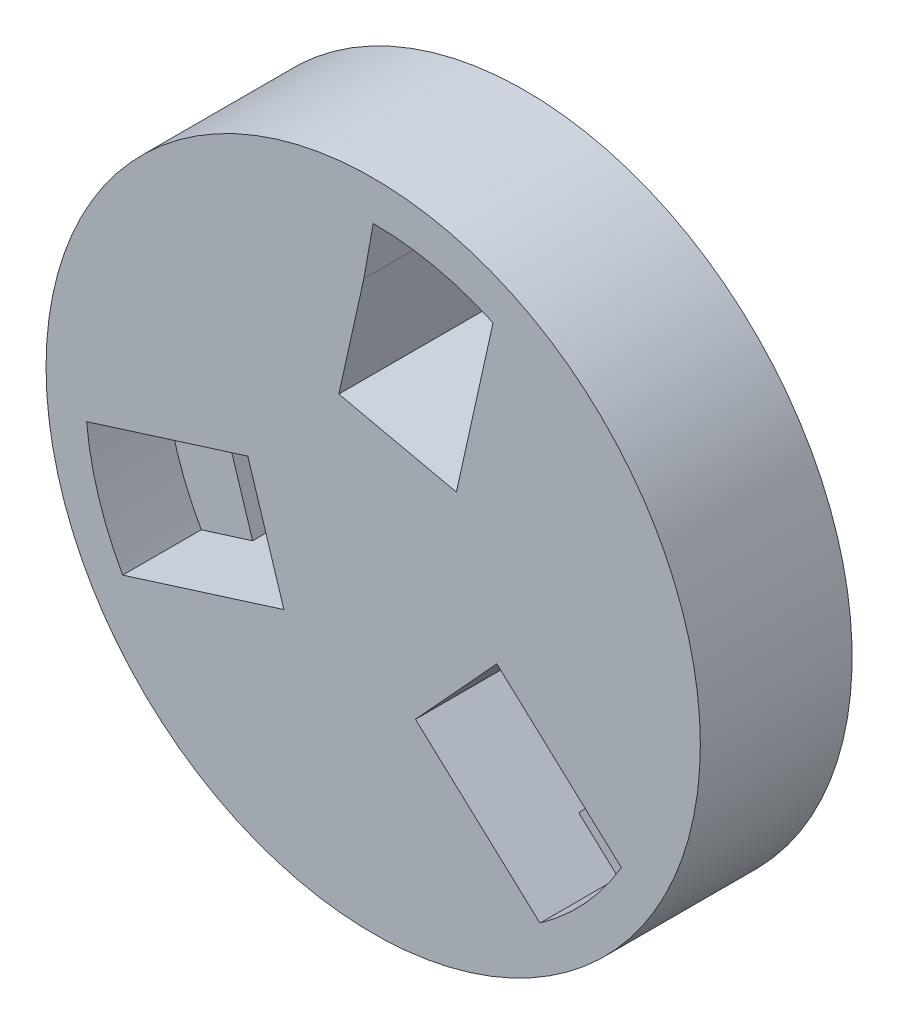
ISO-10303-21;
HEADER;
FILE_DESCRIPTION(('STEP AP214'),'2;1');
FILE_NAME('part.step','',(''),(''),'','','');
FILE_SCHEMA(('AUTOMOTIVE_DESIGN { 1 0 10303 214 1 1 1 1 }'));
ENDSEC;
DATA;
#1=APPLICATION_CONTEXT('core data for automotive mechanical design processes');
#2=APPLICATION_PROTOCOL_DEFINITION('international standard','automotive_design',2000,#1);
#3=PRODUCT_CONTEXT('',#1,'mechanical');
#4=PRODUCT('Part','Part','',(#3));
#5=PRODUCT_RELATED_PRODUCT_CATEGORY('part','',(#4));
#6=PRODUCT_DEFINITION_FORMATION('','',#4);
#7=PRODUCT_DEFINITION_CONTEXT('part definition',#1,'design');
#8=PRODUCT_DEFINITION('design','',#6,#7);
#9=PRODUCT_DEFINITION_SHAPE('','',#8);
#10=(LENGTH_UNIT() NAMED_UNIT(*) SI_UNIT(.MILLI.,.METRE.));
#11=(NAMED_UNIT(*) PLANE_ANGLE_UNIT() SI_UNIT($,.RADIAN.));
#12=(NAMED_UNIT(*) SI_UNIT($,.STERADIAN.) SOLID_ANGLE_UNIT());
#13=UNCERTAINTY_MEASURE_WITH_UNIT(LENGTH_MEASURE(1.E-05),#10,'distance_accuracy_value','');
#14=(GEOMETRIC_REPRESENTATION_CONTEXT(3) GLOBAL_UNCERTAINTY_ASSIGNED_CONTEXT((#13)) GLOBAL_UNIT_ASSIGNED_CONTEXT((#10,
#11,#12)) REPRESENTATION_CONTEXT('',''));
#15=CARTESIAN_POINT('',(0.,0.,0.));
#16=DIRECTION('',(0.,0.,1.));
#17=DIRECTION('',(1.,0.,0.));
#18=AXIS2_PLACEMENT_3D('',#15,#16,#17);
#19=CARTESIAN_POINT('',(0.,0.,1.4));
#20=DIRECTION('',(0.,0.,1.));
#21=DIRECTION('',(1.,0.,0.));
#22=AXIS2_PLACEMENT_3D('',#19,#20,#21);
#23=PLANE('',#22);
#24=CARTESIAN_POINT('',(0.,0.,1.4));
#25=DIRECTION('',(0.,0.,1.));
#26=DIRECTION('',(1.,0.,0.));
#27=AXIS2_PLACEMENT_3D('',#24,#25,#26);
#28=CIRCLE('',#27,5.5);
#29=CARTESIAN_POINT('',(-4.78520263088889,-2.7114268902801,1.4));
#30=VERTEX_POINT('',#29);
#31=CARTESIAN_POINT('',(-5.47560061594028,-0.517491927197329,1.4));
#32=VERTEX_POINT('',#31);
#33=EDGE_CURVE('E115',#30,#32,#28,.F.);
#34=ORIENTED_EDGE('',*,*,#33,.F.);
#35=DIRECTION('',(-0.953884766557725,-0.300173036978865,0.));
#36=VECTOR('',#35,1.);
#37=CARTESIAN_POINT('',(0.345198992525694,-1.09696748154138,1.4));
#38=LINE('',#37,#36);
#39=CARTESIAN_POINT('',(-3.80419974200042,-2.40272019239945,1.4));
#40=VERTEX_POINT('',#39);
#41=EDGE_CURVE('E254',#40,#30,#38,.T.);
#42=ORIENTED_EDGE('',*,*,#41,.F.);
#43=DIRECTION('',(-0.300173036978865,0.953884766557725,0.));
#44=VECTOR('',#43,1.);
#45=CARTESIAN_POINT('',(-4.14939873452611,-1.30575271085806,1.4));
#46=LINE('',#45,#44);
#47=CARTESIAN_POINT('',(-4.4945977270518,-0.208785229316679,1.4));
#48=VERTEX_POINT('',#47);
#49=EDGE_CURVE('E283',#40,#48,#46,.T.);
#50=ORIENTED_EDGE('',*,*,#49,.T.);
#51=DIRECTION('',(-0.953884766557726,-0.300173036978861,0.));
#52=VECTOR('',#51,1.);
#53=CARTESIAN_POINT('',(-0.345198992525685,1.09696748154137,1.4));
#54=LINE('',#53,#52);
#55=EDGE_CURVE('E395',#48,#32,#54,.T.);
#56=ORIENTED_EDGE('',*,*,#55,.T.);
#57=EDGE_LOOP('',(#34,#42,#50,#56));
#58=FACE_BOUND('',#57,.T.);
#59=ADVANCED_FACE('F105',(#58),#23,.T.);
#60=CARTESIAN_POINT('',(0.,0.,2.9));
#61=DIRECTION('',(0.,0.,-1.));
#62=DIRECTION('',(-1.,0.,0.));
#63=AXIS2_PLACEMENT_3D('',#60,#61,#62);
#64=CYLINDRICAL_SURFACE('',#63,5.5);
#65=CARTESIAN_POINT('',(0.,0.,2.9));
#66=DIRECTION('',(0.,0.,1.));
#67=DIRECTION('',(1.,0.,0.));
#68=AXIS2_PLACEMENT_3D('',#65,#66,#67);
#69=CIRCLE('',#68,5.5);
#70=CARTESIAN_POINT('',(-5.47560061594028,-0.517491927197329,2.9));
#71=VERTEX_POINT('',#70);
#72=CARTESIAN_POINT('',(-4.78520263088889,-2.7114268902801,2.9));
#73=VERTEX_POINT('',#72);
#74=EDGE_CURVE('E244',#71,#73,#69,.T.);
#75=ORIENTED_EDGE('',*,*,#74,.T.);
#76=DIRECTION('',(0.,0.,-1.));
#77=VECTOR('',#76,1.);
#78=CARTESIAN_POINT('',(-4.78520263088889,-2.7114268902801,11.6684280802453));
#79=LINE('',#78,#77);
#80=EDGE_CURVE('E252',#73,#30,#79,.T.);
#81=ORIENTED_EDGE('',*,*,#80,.T.);
#82=ORIENTED_EDGE('',*,*,#33,.T.);
#83=DIRECTION('',(0.,0.,-1.));
#84=VECTOR('',#83,1.);
#85=CARTESIAN_POINT('',(-5.47560061594028,-0.517491927197329,11.6684280802453));
#86=LINE('',#85,#84);
#87=EDGE_CURVE('E263',#71,#32,#86,.T.);
#88=ORIENTED_EDGE('',*,*,#87,.F.);
#89=EDGE_LOOP('',(#75,#81,#82,#88));
#90=FACE_BOUND('',#89,.T.);
#91=ADVANCED_FACE('F261',(#90),#64,.F.);
#92=CARTESIAN_POINT('',(0.,5.5,1.4));
#93=VERTEX_POINT('',#92);
#94=CARTESIAN_POINT('',(2.28963915276383,5.00075519798069,1.4));
#95=VERTEX_POINT('',#94);
#96=EDGE_CURVE('E116',#93,#95,#28,.F.);
#97=ORIENTED_EDGE('',*,*,#96,.F.);
#98=DIRECTION('',(0.175232043789791,0.984527161041915,0.));
#99=VECTOR('',#98,1.);
#100=CARTESIAN_POINT('',(-0.948863886277644,0.16888448043911,1.4));
#101=LINE('',#100,#99);
#102=CARTESIAN_POINT('',(-0.178716853803592,4.49589371384228,1.4));
#103=VERTEX_POINT('',#102);
#104=EDGE_CURVE('E409',#103,#93,#101,.T.);
#105=ORIENTED_EDGE('',*,*,#104,.F.);
#106=DIRECTION('',(-0.976174958611413,0.216984907724031,0.));
#107=VECTOR('',#106,1.);
#108=CARTESIAN_POINT('',(0.943884348599533,4.24636106995965,1.4));
#109=LINE('',#108,#107);
#110=CARTESIAN_POINT('',(2.06648555100266,3.99682842607701,1.4));
#111=VERTEX_POINT('',#110);
#112=EDGE_CURVE('E304',#111,#103,#109,.T.);
#113=ORIENTED_EDGE('',*,*,#112,.F.);
#114=DIRECTION('',(0.21698490772403,0.976174958611413,0.));
#115=VECTOR('',#114,1.);
#116=CARTESIAN_POINT('',(1.12260120240313,-0.249532643882635,1.4));
#117=LINE('',#116,#115);
#118=EDGE_CURVE('E416',#111,#95,#117,.T.);
#119=ORIENTED_EDGE('',*,*,#118,.T.);
#120=EDGE_LOOP('',(#97,#105,#113,#119));
#121=FACE_BOUND('',#120,.T.);
#122=ADVANCED_FACE('F467',(#121),#23,.T.);
#123=CARTESIAN_POINT('',(2.28963915276383,5.00075519798069,2.9));
#124=VERTEX_POINT('',#123);
#125=CARTESIAN_POINT('',(0.,5.5,2.9));
#126=VERTEX_POINT('',#125);
#127=EDGE_CURVE('E265',#124,#126,#69,.T.);
#128=ORIENTED_EDGE('',*,*,#127,.T.);
#129=DIRECTION('',(0.,0.,-1.));
#130=VECTOR('',#129,1.);
#131=CARTESIAN_POINT('',(0.,5.5,11.6684280802453));
#132=LINE('',#131,#130);
#133=EDGE_CURVE('E402',#126,#93,#132,.T.);
#134=ORIENTED_EDGE('',*,*,#133,.T.);
#135=ORIENTED_EDGE('',*,*,#96,.T.);
#136=DIRECTION('',(0.,0.,-1.));
#137=VECTOR('',#136,1.);
#138=CARTESIAN_POINT('',(2.28963915276383,5.00075519798069,11.6684280802453));
#139=LINE('',#138,#137);
#140=EDGE_CURVE('E421',#124,#95,#139,.T.);
#141=ORIENTED_EDGE('',*,*,#140,.F.);
#142=EDGE_LOOP('',(#128,#134,#135,#141));
#143=FACE_BOUND('',#142,.T.);
#144=ADVANCED_FACE('F524',(#143),#64,.F.);
#145=DIRECTION('',(0.736899858833691,-0.676001921632539,0.));
#146=VECTOR('',#145,1.);
#147=CARTESIAN_POINT('',(-0.777402209877428,-0.847434837658754,1.4));
#148=LINE('',#147,#146);
#149=CARTESIAN_POINT('',(2.42811217604913,-3.7880431967603,1.4));
#150=VERTEX_POINT('',#149);
#151=CARTESIAN_POINT('',(3.18596146317643,-4.48326327078331,1.4));
#152=VERTEX_POINT('',#151);
#153=EDGE_CURVE('E258',#150,#152,#148,.T.);
#154=ORIENTED_EDGE('',*,*,#153,.T.);
#155=CARTESIAN_POINT('',(4.74076588293128,-2.78839359546583,1.4));
#156=VERTEX_POINT('',#155);
#157=EDGE_CURVE('E12',#156,#152,#28,.F.);
#158=ORIENTED_EDGE('',*,*,#157,.F.);
#159=DIRECTION('',(0.73689985883369,-0.67600192163254,0.));
#160=VECTOR('',#159,1.);
#161=CARTESIAN_POINT('',(0.777402209877416,0.847434837658738,1.4));
#162=LINE('',#161,#160);
#163=CARTESIAN_POINT('',(3.98291659580397,-2.09317352144281,1.4));
#164=VERTEX_POINT('',#163);
#165=EDGE_CURVE('E407',#164,#156,#162,.T.);
#166=ORIENTED_EDGE('',*,*,#165,.F.);
#167=DIRECTION('',(-0.67600192163254,-0.736899858833691,0.));
#168=VECTOR('',#167,1.);
#169=CARTESIAN_POINT('',(3.20551438592656,-2.94060835910155,1.4));
#170=LINE('',#169,#168);
#171=EDGE_CURVE('E335',#164,#150,#170,.T.);
#172=ORIENTED_EDGE('',*,*,#171,.T.);
#173=EDGE_LOOP('',(#154,#158,#166,#172));
#174=FACE_BOUND('',#173,.T.);
#175=ADVANCED_FACE('F484',(#174),#23,.T.);
#176=DIRECTION('',(0.,0.,-1.));
#177=VECTOR('',#176,1.);
#178=CARTESIAN_POINT('',(3.18596146317643,-4.48326327078331,11.6684280802453));
#179=LINE('',#178,#177);
#180=CARTESIAN_POINT('',(3.18596146317643,-4.48326327078331,2.9));
#181=VERTEX_POINT('',#180);
#182=EDGE_CURVE('E474',#181,#152,#179,.T.);
#183=ORIENTED_EDGE('',*,*,#182,.F.);
#184=CARTESIAN_POINT('',(4.74076588293128,-2.78839359546583,2.9));
#185=VERTEX_POINT('',#184);
#186=EDGE_CURVE('E266',#181,#185,#69,.T.);
#187=ORIENTED_EDGE('',*,*,#186,.T.);
#188=DIRECTION('',(0.,0.,-1.));
#189=VECTOR('',#188,1.);
#190=CARTESIAN_POINT('',(4.74076588293128,-2.78839359546583,11.6684280802453));
#191=LINE('',#190,#189);
#192=EDGE_CURVE('E424',#185,#156,#191,.T.);
#193=ORIENTED_EDGE('',*,*,#192,.T.);
#194=ORIENTED_EDGE('',*,*,#157,.T.);
#195=EDGE_LOOP('',(#183,#187,#193,#194));
#196=FACE_BOUND('',#195,.T.);
#197=ADVANCED_FACE('F486',(#196),#64,.F.);
#198=CARTESIAN_POINT('',(0.,0.,0.));
#199=DIRECTION('',(0.,0.,1.));
#200=DIRECTION('',(1.,0.,0.));
#201=AXIS2_PLACEMENT_3D('',#198,#199,#200);
#202=PLANE('',#201);
#203=DIRECTION('',(-0.67600192163254,-0.736899858833691,0.));
#204=VECTOR('',#203,1.);
#205=CARTESIAN_POINT('',(3.20551438592656,-2.94060835910155,0.));
#206=LINE('',#205,#204);
#207=CARTESIAN_POINT('',(3.98291659580397,-2.09317352144281,0.));
#208=VERTEX_POINT('',#207);
#209=CARTESIAN_POINT('',(2.42811217604913,-3.7880431967603,0.));
#210=VERTEX_POINT('',#209);
#211=EDGE_CURVE('E345',#208,#210,#206,.T.);
#212=ORIENTED_EDGE('',*,*,#211,.F.);
#213=DIRECTION('',(0.73689985883369,-0.67600192163254,0.));
#214=VECTOR('',#213,1.);
#215=CARTESIAN_POINT('',(0.777402209877416,0.847434837658738,0.));
#216=LINE('',#215,#214);
#217=CARTESIAN_POINT('',(2.36173690636985,-0.605969293851226,0.));
#218=VERTEX_POINT('',#217);
#219=EDGE_CURVE('E348',#218,#208,#216,.T.);
#220=ORIENTED_EDGE('',*,*,#219,.F.);
#221=DIRECTION('',(-0.676001921632543,-0.736899858833688,0.));
#222=VECTOR('',#221,1.);
#223=CARTESIAN_POINT('',(1.58433469649243,-1.45340413150997,0.));
#224=LINE('',#223,#222);
#225=CARTESIAN_POINT('',(0.806932486615004,-2.30083896916871,0.));
#226=VERTEX_POINT('',#225);
#227=EDGE_CURVE('E351',#218,#226,#224,.T.);
#228=ORIENTED_EDGE('',*,*,#227,.T.);
#229=DIRECTION('',(-0.736899858833691,0.67600192163254,0.));
#230=VECTOR('',#229,1.);
#231=CARTESIAN_POINT('',(-0.777402209877427,-0.847434837658751,0.));
#232=LINE('',#231,#230);
#233=EDGE_CURVE('E355',#210,#226,#232,.T.);
#234=ORIENTED_EDGE('',*,*,#233,.F.);
#235=EDGE_LOOP('',(#212,#220,#228,#234));
#236=FACE_BOUND('',#235,.T.);
#237=DIRECTION('',(-0.976174958611413,0.216984907724031,0.));
#238=VECTOR('',#237,1.);
#239=CARTESIAN_POINT('',(0.943884348599533,4.24636106995965,0.));
#240=LINE('',#239,#238);
#241=CARTESIAN_POINT('',(2.06648555100266,3.99682842607701,0.));
#242=VERTEX_POINT('',#241);
#243=CARTESIAN_POINT('',(-0.178716853803592,4.49589371384228,0.));
#244=VERTEX_POINT('',#243);
#245=EDGE_CURVE('E323',#242,#244,#240,.T.);
#246=ORIENTED_EDGE('',*,*,#245,.T.);
#247=DIRECTION('',(-0.216984907724031,-0.976174958611413,0.));
#248=VECTOR('',#247,1.);
#249=CARTESIAN_POINT('',(-1.12260120240313,0.249532643882635,0.));
#250=LINE('',#249,#248);
#251=CARTESIAN_POINT('',(-0.656083650796459,2.34830880489717,0.));
#252=VERTEX_POINT('',#251);
#253=EDGE_CURVE('E313',#244,#252,#250,.T.);
#254=ORIENTED_EDGE('',*,*,#253,.T.);
#255=DIRECTION('',(0.976174958611413,-0.21698490772403,0.));
#256=VECTOR('',#255,1.);
#257=CARTESIAN_POINT('',(0.466517551606665,2.09877616101454,0.));
#258=LINE('',#257,#256);
#259=CARTESIAN_POINT('',(1.58911875400979,1.8492435171319,0.));
#260=VERTEX_POINT('',#259);
#261=EDGE_CURVE('E317',#252,#260,#258,.T.);
#262=ORIENTED_EDGE('',*,*,#261,.T.);
#263=DIRECTION('',(0.21698490772403,0.976174958611413,0.));
#264=VECTOR('',#263,1.);
#265=CARTESIAN_POINT('',(1.12260120240313,-0.249532643882635,0.));
#266=LINE('',#265,#264);
#267=EDGE_CURVE('E131',#260,#242,#266,.T.);
#268=ORIENTED_EDGE('',*,*,#267,.T.);
#269=EDGE_LOOP('',(#246,#254,#262,#268));
#270=FACE_BOUND('',#269,.T.);
#271=DIRECTION('',(0.953884766557726,0.300173036978861,0.));
#272=VECTOR('',#271,1.);
#273=CARTESIAN_POINT('',(-0.345198992525686,1.09696748154137,0.));
#274=LINE('',#273,#272);
#275=CARTESIAN_POINT('',(-4.49459772705181,-0.208785229316679,0.));
#276=VERTEX_POINT('',#275);
#277=CARTESIAN_POINT('',(-2.3960512406248,0.451595452036819,0.));
#278=VERTEX_POINT('',#277);
#279=EDGE_CURVE('E284',#276,#278,#274,.T.);
#280=ORIENTED_EDGE('',*,*,#279,.F.);
#281=DIRECTION('',(-0.300173036978865,0.953884766557725,0.));
#282=VECTOR('',#281,1.);
#283=CARTESIAN_POINT('',(-4.14939873452611,-1.30575271085806,0.));
#284=LINE('',#283,#282);
#285=CARTESIAN_POINT('',(-3.80419974200042,-2.40272019239945,0.));
#286=VERTEX_POINT('',#285);
#287=EDGE_CURVE('E287',#286,#276,#284,.T.);
#288=ORIENTED_EDGE('',*,*,#287,.F.);
#289=DIRECTION('',(-0.953884766557725,-0.300173036978865,0.));
#290=VECTOR('',#289,1.);
#291=CARTESIAN_POINT('',(0.345198992525694,-1.09696748154138,0.));
#292=LINE('',#291,#290);
#293=CARTESIAN_POINT('',(-1.70565325557342,-1.74233951104594,0.));
#294=VERTEX_POINT('',#293);
#295=EDGE_CURVE('E290',#294,#286,#292,.T.);
#296=ORIENTED_EDGE('',*,*,#295,.F.);
#297=DIRECTION('',(-0.30017303697886,0.953884766557726,0.));
#298=VECTOR('',#297,1.);
#299=CARTESIAN_POINT('',(-2.05085224809911,-0.645372029504549,0.));
#300=LINE('',#299,#298);
#301=EDGE_CURVE('E293',#294,#278,#300,.T.);
#302=ORIENTED_EDGE('',*,*,#301,.T.);
#303=EDGE_LOOP('',(#280,#288,#296,#302));
#304=FACE_BOUND('',#303,.T.);
#305=CARTESIAN_POINT('',(0.,0.,0.));
#306=DIRECTION('',(0.,0.,-1.));
#307=DIRECTION('',(-1.,0.,0.));
#308=AXIS2_PLACEMENT_3D('',#305,#306,#307);
#309=CIRCLE('',#308,6.25);
#310=CARTESIAN_POINT('',(-6.25,0.,0.));
#311=VERTEX_POINT('',#310);
#312=EDGE_CURVE('E279',#311,#311,#309,.T.);
#313=ORIENTED_EDGE('',*,*,#312,.T.);
#314=EDGE_LOOP('',(#313));
#315=FACE_BOUND('',#314,.T.);
#316=ADVANCED_FACE('F499',(#236,#270,#304,#315),#202,.F.);
#317=CARTESIAN_POINT('',(3.20551438592656,-2.94060835910155,0.));
#318=DIRECTION('',(-0.736899858833691,0.67600192163254,0.));
#319=DIRECTION('',(-0.67600192163254,-0.736899858833691,0.));
#320=AXIS2_PLACEMENT_3D('',#317,#318,#319);
#321=PLANE('',#320);
#322=ORIENTED_EDGE('',*,*,#171,.F.);
#323=DIRECTION('',(0.,0.,1.));
#324=VECTOR('',#323,1.);
#325=CARTESIAN_POINT('',(3.98291659580397,-2.09317352144281,0.));
#326=LINE('',#325,#324);
#327=EDGE_CURVE('E358',#208,#164,#326,.T.);
#328=ORIENTED_EDGE('',*,*,#327,.F.);
#329=ORIENTED_EDGE('',*,*,#211,.T.);
#330=DIRECTION('',(0.,0.,1.));
#331=VECTOR('',#330,1.);
#332=CARTESIAN_POINT('',(2.42811217604913,-3.7880431967603,0.));
#333=LINE('',#332,#331);
#334=EDGE_CURVE('E362',#210,#150,#333,.T.);
#335=ORIENTED_EDGE('',*,*,#334,.T.);
#336=EDGE_LOOP('',(#322,#328,#329,#335));
#337=FACE_BOUND('',#336,.T.);
#338=ADVANCED_FACE('F494',(#337),#321,.T.);
#339=CARTESIAN_POINT('',(-0.777402209877427,-0.847434837658751,0.));
#340=DIRECTION('',(0.67600192163254,0.736899858833691,0.));
#341=DIRECTION('',(-0.736899858833691,0.67600192163254,0.));
#342=AXIS2_PLACEMENT_3D('',#339,#340,#341);
#343=PLANE('',#342);
#344=ORIENTED_EDGE('',*,*,#153,.F.);
#345=ORIENTED_EDGE('',*,*,#334,.F.);
#346=ORIENTED_EDGE('',*,*,#233,.T.);
#347=DIRECTION('',(0.,0.,1.));
#348=VECTOR('',#347,1.);
#349=CARTESIAN_POINT('',(0.806932486615004,-2.30083896916871,0.));
#350=LINE('',#349,#348);
#351=CARTESIAN_POINT('',(0.806932486615003,-2.30083896916871,2.9));
#352=VERTEX_POINT('',#351);
#353=EDGE_CURVE('E367',#226,#352,#350,.T.);
#354=ORIENTED_EDGE('',*,*,#353,.T.);
#355=DIRECTION('',(-0.736899858833691,0.67600192163254,0.));
#356=VECTOR('',#355,1.);
#357=CARTESIAN_POINT('',(-0.777402209877427,-0.847434837658751,2.9));
#358=LINE('',#357,#356);
#359=EDGE_CURVE('E249',#181,#352,#358,.T.);
#360=ORIENTED_EDGE('',*,*,#359,.F.);
#361=ORIENTED_EDGE('',*,*,#182,.T.);
#362=EDGE_LOOP('',(#344,#345,#346,#354,#360,#361));
#363=FACE_BOUND('',#362,.T.);
#364=ADVANCED_FACE('F478',(#363),#343,.T.);
#365=CARTESIAN_POINT('',(1.58433469649243,-1.45340413150997,0.));
#366=DIRECTION('',(-0.736899858833688,0.676001921632543,0.));
#367=DIRECTION('',(-0.676001921632543,-0.736899858833688,0.));
#368=AXIS2_PLACEMENT_3D('',#365,#366,#367);
#369=PLANE('',#368);
#370=DIRECTION('',(0.,0.,1.));
#371=VECTOR('',#370,1.);
#372=CARTESIAN_POINT('',(2.36173690636985,-0.605969293851226,0.));
#373=LINE('',#372,#371);
#374=CARTESIAN_POINT('',(2.36173690636985,-0.605969293851226,2.9));
#375=VERTEX_POINT('',#374);
#376=EDGE_CURVE('E370',#218,#375,#373,.T.);
#377=ORIENTED_EDGE('',*,*,#376,.T.);
#378=DIRECTION('',(0.676001921632543,0.736899858833688,0.));
#379=VECTOR('',#378,1.);
#380=CARTESIAN_POINT('',(1.58433469649243,-1.45340413150997,2.9));
#381=LINE('',#380,#379);
#382=EDGE_CURVE('E439',#352,#375,#381,.T.);
#383=ORIENTED_EDGE('',*,*,#382,.F.);
#384=ORIENTED_EDGE('',*,*,#353,.F.);
#385=ORIENTED_EDGE('',*,*,#227,.F.);
#386=EDGE_LOOP('',(#377,#383,#384,#385));
#387=FACE_BOUND('',#386,.T.);
#388=ADVANCED_FACE('F503',(#387),#369,.F.);
#389=CARTESIAN_POINT('',(0.777402209877416,0.847434837658738,0.));
#390=DIRECTION('',(-0.67600192163254,-0.736899858833691,0.));
#391=DIRECTION('',(0.736899858833691,-0.67600192163254,0.));
#392=AXIS2_PLACEMENT_3D('',#389,#390,#391);
#393=PLANE('',#392);
#394=ORIENTED_EDGE('',*,*,#327,.T.);
#395=ORIENTED_EDGE('',*,*,#165,.T.);
#396=ORIENTED_EDGE('',*,*,#192,.F.);
#397=DIRECTION('',(0.73689985883369,-0.67600192163254,0.));
#398=VECTOR('',#397,1.);
#399=CARTESIAN_POINT('',(0.777402209877416,0.847434837658738,2.9));
#400=LINE('',#399,#398);
#401=EDGE_CURVE('E443',#375,#185,#400,.T.);
#402=ORIENTED_EDGE('',*,*,#401,.F.);
#403=ORIENTED_EDGE('',*,*,#376,.F.);
#404=ORIENTED_EDGE('',*,*,#219,.T.);
#405=EDGE_LOOP('',(#394,#395,#396,#402,#403,#404));
#406=FACE_BOUND('',#405,.T.);
#407=ADVANCED_FACE('F490',(#406),#393,.T.);
#408=CARTESIAN_POINT('',(-1.12260120240313,0.249532643882635,0.));
#409=DIRECTION('',(-0.976174958611413,0.216984907724031,0.));
#410=DIRECTION('',(-0.216984907724031,-0.976174958611413,0.));
#411=AXIS2_PLACEMENT_3D('',#408,#409,#410);
#412=PLANE('',#411);
#413=DIRECTION('',(0.,0.,1.));
#414=VECTOR('',#413,1.);
#415=CARTESIAN_POINT('',(-0.178716853803592,4.49589371384228,0.));
#416=LINE('',#415,#414);
#417=EDGE_CURVE('E331',#244,#103,#416,.T.);
#418=ORIENTED_EDGE('',*,*,#417,.T.);
#419=DIRECTION('',(0.,0.,-1.));
#420=VECTOR('',#419,1.);
#421=CARTESIAN_POINT('',(-0.178716853803592,4.49589371384228,11.6684280802453));
#422=LINE('',#421,#420);
#423=CARTESIAN_POINT('',(-0.178716853803592,4.49589371384228,2.9));
#424=VERTEX_POINT('',#423);
#425=EDGE_CURVE('E398',#424,#103,#422,.T.);
#426=ORIENTED_EDGE('',*,*,#425,.F.);
#427=DIRECTION('',(0.216984907724031,0.976174958611413,0.));
#428=VECTOR('',#427,1.);
#429=CARTESIAN_POINT('',(-1.12260120240313,0.249532643882635,2.9));
#430=LINE('',#429,#428);
#431=CARTESIAN_POINT('',(-0.65608365079646,2.34830880489717,2.9));
#432=VERTEX_POINT('',#431);
#433=EDGE_CURVE('E420',#432,#424,#430,.T.);
#434=ORIENTED_EDGE('',*,*,#433,.F.);
#435=DIRECTION('',(0.,0.,1.));
#436=VECTOR('',#435,1.);
#437=CARTESIAN_POINT('',(-0.656083650796459,2.34830880489717,0.));
#438=LINE('',#437,#436);
#439=EDGE_CURVE('E327',#252,#432,#438,.T.);
#440=ORIENTED_EDGE('',*,*,#439,.F.);
#441=ORIENTED_EDGE('',*,*,#253,.F.);
#442=EDGE_LOOP('',(#418,#426,#434,#440,#441));
#443=FACE_BOUND('',#442,.T.);
#444=ADVANCED_FACE('F459',(#443),#412,.F.);
#445=CARTESIAN_POINT('',(0.943884348599533,4.24636106995965,0.));
#446=DIRECTION('',(0.216984907724031,0.976174958611413,0.));
#447=DIRECTION('',(-0.976174958611413,0.216984907724031,0.));
#448=AXIS2_PLACEMENT_3D('',#445,#446,#447);
#449=PLANE('',#448);
#450=ORIENTED_EDGE('',*,*,#112,.T.);
#451=ORIENTED_EDGE('',*,*,#417,.F.);
#452=ORIENTED_EDGE('',*,*,#245,.F.);
#453=DIRECTION('',(0.,0.,1.));
#454=VECTOR('',#453,1.);
#455=CARTESIAN_POINT('',(2.06648555100266,3.99682842607701,0.));
#456=LINE('',#455,#454);
#457=EDGE_CURVE('E336',#242,#111,#456,.T.);
#458=ORIENTED_EDGE('',*,*,#457,.T.);
#459=EDGE_LOOP('',(#450,#451,#452,#458));
#460=FACE_BOUND('',#459,.T.);
#461=ADVANCED_FACE('F547',(#460),#449,.F.);
#462=CARTESIAN_POINT('',(1.12260120240313,-0.249532643882635,0.));
#463=DIRECTION('',(0.976174958611413,-0.21698490772403,0.));
#464=DIRECTION('',(0.21698490772403,0.976174958611413,0.));
#465=AXIS2_PLACEMENT_3D('',#462,#463,#464);
#466=PLANE('',#465);
#467=ORIENTED_EDGE('',*,*,#118,.F.);
#468=ORIENTED_EDGE('',*,*,#457,.F.);
#469=ORIENTED_EDGE('',*,*,#267,.F.);
#470=DIRECTION('',(0.,0.,1.));
#471=VECTOR('',#470,1.);
#472=CARTESIAN_POINT('',(1.58911875400979,1.8492435171319,0.));
#473=LINE('',#472,#471);
#474=CARTESIAN_POINT('',(1.58911875400979,1.8492435171319,2.9));
#475=VERTEX_POINT('',#474);
#476=EDGE_CURVE('E340',#260,#475,#473,.T.);
#477=ORIENTED_EDGE('',*,*,#476,.T.);
#478=DIRECTION('',(-0.21698490772403,-0.976174958611413,0.));
#479=VECTOR('',#478,1.);
#480=CARTESIAN_POINT('',(1.12260120240313,-0.249532643882635,2.9));
#481=LINE('',#480,#479);
#482=EDGE_CURVE('E446',#124,#475,#481,.T.);
#483=ORIENTED_EDGE('',*,*,#482,.F.);
#484=ORIENTED_EDGE('',*,*,#140,.T.);
#485=EDGE_LOOP('',(#467,#468,#469,#477,#483,#484));
#486=FACE_BOUND('',#485,.T.);
#487=ADVANCED_FACE('F550',(#486),#466,.F.);
#488=CARTESIAN_POINT('',(0.466517551606665,2.09877616101454,0.));
#489=DIRECTION('',(-0.21698490772403,-0.976174958611413,0.));
#490=DIRECTION('',(0.976174958611413,-0.21698490772403,0.));
#491=AXIS2_PLACEMENT_3D('',#488,#489,#490);
#492=PLANE('',#491);
#493=ORIENTED_EDGE('',*,*,#439,.T.);
#494=DIRECTION('',(-0.976174958611413,0.21698490772403,0.));
#495=VECTOR('',#494,1.);
#496=CARTESIAN_POINT('',(0.466517551606665,2.09877616101454,2.9));
#497=LINE('',#496,#495);
#498=EDGE_CURVE('E272',#475,#432,#497,.T.);
#499=ORIENTED_EDGE('',*,*,#498,.F.);
#500=ORIENTED_EDGE('',*,*,#476,.F.);
#501=ORIENTED_EDGE('',*,*,#261,.F.);
#502=EDGE_LOOP('',(#493,#499,#500,#501));
#503=FACE_BOUND('',#502,.T.);
#504=ADVANCED_FACE('F546',(#503),#492,.F.);
#505=CARTESIAN_POINT('',(-0.345198992525686,1.09696748154137,0.));
#506=DIRECTION('',(0.300173036978861,-0.953884766557726,0.));
#507=DIRECTION('',(0.953884766557726,0.300173036978861,0.));
#508=AXIS2_PLACEMENT_3D('',#505,#506,#507);
#509=PLANE('',#508);
#510=ORIENTED_EDGE('',*,*,#55,.F.);
#511=DIRECTION('',(0.,0.,1.));
#512=VECTOR('',#511,1.);
#513=CARTESIAN_POINT('',(-4.49459772705181,-0.208785229316679,0.));
#514=LINE('',#513,#512);
#515=EDGE_CURVE('E297',#276,#48,#514,.T.);
#516=ORIENTED_EDGE('',*,*,#515,.F.);
#517=ORIENTED_EDGE('',*,*,#279,.T.);
#518=DIRECTION('',(0.,0.,1.));
#519=VECTOR('',#518,1.);
#520=CARTESIAN_POINT('',(-2.3960512406248,0.451595452036819,0.));
#521=LINE('',#520,#519);
#522=CARTESIAN_POINT('',(-2.3960512406248,0.451595452036819,2.9));
#523=VERTEX_POINT('',#522);
#524=EDGE_CURVE('E301',#278,#523,#521,.T.);
#525=ORIENTED_EDGE('',*,*,#524,.T.);
#526=DIRECTION('',(0.953884766557726,0.300173036978861,0.));
#527=VECTOR('',#526,1.);
#528=CARTESIAN_POINT('',(-0.345198992525686,1.09696748154137,2.9));
#529=LINE('',#528,#527);
#530=EDGE_CURVE('E396',#71,#523,#529,.T.);
#531=ORIENTED_EDGE('',*,*,#530,.F.);
#532=ORIENTED_EDGE('',*,*,#87,.T.);
#533=EDGE_LOOP('',(#510,#516,#517,#525,#531,#532));
#534=FACE_BOUND('',#533,.T.);
#535=ADVANCED_FACE('F393',(#534),#509,.T.);
#536=CARTESIAN_POINT('',(-2.05085224809911,-0.645372029504549,0.));
#537=DIRECTION('',(0.953884766557726,0.30017303697886,0.));
#538=DIRECTION('',(-0.30017303697886,0.953884766557726,0.));
#539=AXIS2_PLACEMENT_3D('',#536,#537,#538);
#540=PLANE('',#539);
#541=DIRECTION('',(0.,0.,1.));
#542=VECTOR('',#541,1.);
#543=CARTESIAN_POINT('',(-1.70565325557342,-1.74233951104594,0.));
#544=LINE('',#543,#542);
#545=CARTESIAN_POINT('',(-1.70565325557342,-1.74233951104594,2.9));
#546=VERTEX_POINT('',#545);
#547=EDGE_CURVE('E305',#294,#546,#544,.T.);
#548=ORIENTED_EDGE('',*,*,#547,.T.);
#549=DIRECTION('',(0.30017303697886,-0.953884766557726,0.));
#550=VECTOR('',#549,1.);
#551=CARTESIAN_POINT('',(-2.05085224809911,-0.645372029504549,2.9));
#552=LINE('',#551,#550);
#553=EDGE_CURVE('E246',#523,#546,#552,.T.);
#554=ORIENTED_EDGE('',*,*,#553,.F.);
#555=ORIENTED_EDGE('',*,*,#524,.F.);
#556=ORIENTED_EDGE('',*,*,#301,.F.);
#557=EDGE_LOOP('',(#548,#554,#555,#556));
#558=FACE_BOUND('',#557,.T.);
#559=ADVANCED_FACE('F536',(#558),#540,.F.);
#560=CARTESIAN_POINT('',(0.345198992525694,-1.09696748154138,0.));
#561=DIRECTION('',(-0.300173036978865,0.953884766557725,0.));
#562=DIRECTION('',(-0.953884766557725,-0.300173036978865,0.));
#563=AXIS2_PLACEMENT_3D('',#560,#561,#562);
#564=PLANE('',#563);
#565=DIRECTION('',(0.,0.,1.));
#566=VECTOR('',#565,1.);
#567=CARTESIAN_POINT('',(-3.80419974200042,-2.40272019239945,0.));
#568=LINE('',#567,#566);
#569=EDGE_CURVE('E123',#286,#40,#568,.T.);
#570=ORIENTED_EDGE('',*,*,#569,.T.);
#571=ORIENTED_EDGE('',*,*,#41,.T.);
#572=ORIENTED_EDGE('',*,*,#80,.F.);
#573=DIRECTION('',(-0.953884766557725,-0.300173036978865,0.));
#574=VECTOR('',#573,1.);
#575=CARTESIAN_POINT('',(0.345198992525694,-1.09696748154138,2.9));
#576=LINE('',#575,#574);
#577=EDGE_CURVE('E238',#546,#73,#576,.T.);
#578=ORIENTED_EDGE('',*,*,#577,.F.);
#579=ORIENTED_EDGE('',*,*,#547,.F.);
#580=ORIENTED_EDGE('',*,*,#295,.T.);
#581=EDGE_LOOP('',(#570,#571,#572,#578,#579,#580));
#582=FACE_BOUND('',#581,.T.);
#583=ADVANCED_FACE('F253',(#582),#564,.T.);
#584=CARTESIAN_POINT('',(-4.14939873452611,-1.30575271085806,0.));
#585=DIRECTION('',(0.953884766557725,0.300173036978865,0.));
#586=DIRECTION('',(-0.300173036978865,0.953884766557725,0.));
#587=AXIS2_PLACEMENT_3D('',#584,#585,#586);
#588=PLANE('',#587);
#589=ORIENTED_EDGE('',*,*,#49,.F.);
#590=ORIENTED_EDGE('',*,*,#569,.F.);
#591=ORIENTED_EDGE('',*,*,#287,.T.);
#592=ORIENTED_EDGE('',*,*,#515,.T.);
#593=EDGE_LOOP('',(#589,#590,#591,#592));
#594=FACE_BOUND('',#593,.T.);
#595=ADVANCED_FACE('F514',(#594),#588,.T.);
#596=CARTESIAN_POINT('',(0.,0.,19.0776695296637));
#597=DIRECTION('',(0.,0.,-1.));
#598=DIRECTION('',(-1.,0.,0.));
#599=AXIS2_PLACEMENT_3D('',#596,#597,#598);
#600=CYLINDRICAL_SURFACE('',#599,6.25);
#601=ORIENTED_EDGE('',*,*,#312,.F.);
#602=EDGE_LOOP('',(#601));
#603=FACE_BOUND('',#602,.T.);
#604=CARTESIAN_POINT('',(0.,0.,2.9));
#605=DIRECTION('',(0.,0.,1.));
#606=DIRECTION('',(1.,0.,0.));
#607=AXIS2_PLACEMENT_3D('',#604,#605,#606);
#608=CIRCLE('',#607,6.25);
#609=CARTESIAN_POINT('',(6.25,0.,2.9));
#610=VERTEX_POINT('',#609);
#611=EDGE_CURVE('E271',#610,#610,#608,.T.);
#612=ORIENTED_EDGE('',*,*,#611,.F.);
#613=EDGE_LOOP('',(#612));
#614=FACE_BOUND('',#613,.T.);
#615=ADVANCED_FACE('F507',(#603,#614),#600,.T.);
#616=CARTESIAN_POINT('',(0.,0.,2.9));
#617=DIRECTION('',(0.,0.,1.));
#618=DIRECTION('',(1.,0.,0.));
#619=AXIS2_PLACEMENT_3D('',#616,#617,#618);
#620=PLANE('',#619);
#621=ORIENTED_EDGE('',*,*,#186,.F.);
#622=ORIENTED_EDGE('',*,*,#359,.T.);
#623=ORIENTED_EDGE('',*,*,#382,.T.);
#624=ORIENTED_EDGE('',*,*,#401,.T.);
#625=EDGE_LOOP('',(#621,#622,#623,#624));
#626=FACE_BOUND('',#625,.T.);
#627=ORIENTED_EDGE('',*,*,#74,.F.);
#628=ORIENTED_EDGE('',*,*,#530,.T.);
#629=ORIENTED_EDGE('',*,*,#553,.T.);
#630=ORIENTED_EDGE('',*,*,#577,.T.);
#631=EDGE_LOOP('',(#627,#628,#629,#630));
#632=FACE_BOUND('',#631,.T.);
#633=ORIENTED_EDGE('',*,*,#127,.F.);
#634=ORIENTED_EDGE('',*,*,#482,.T.);
#635=ORIENTED_EDGE('',*,*,#498,.T.);
#636=ORIENTED_EDGE('',*,*,#433,.T.);
#637=DIRECTION('',(0.175232043789791,0.984527161041915,0.));
#638=VECTOR('',#637,1.);
#639=CARTESIAN_POINT('',(-0.948863886277644,0.16888448043911,2.9));
#640=LINE('',#639,#638);
#641=EDGE_CURVE('E401',#424,#126,#640,.T.);
#642=ORIENTED_EDGE('',*,*,#641,.T.);
#643=EDGE_LOOP('',(#633,#634,#635,#636,#642));
#644=FACE_BOUND('',#643,.T.);
#645=ORIENTED_EDGE('',*,*,#611,.T.);
#646=EDGE_LOOP('',(#645));
#647=FACE_BOUND('',#646,.T.);
#648=ADVANCED_FACE('F240',(#626,#632,#644,#647),#620,.T.);
#649=CARTESIAN_POINT('',(-0.948863886277644,0.16888448043911,11.6684280802453));
#650=DIRECTION('',(-0.984527161041915,0.175232043789791,0.));
#651=DIRECTION('',(-0.175232043789791,-0.984527161041915,0.));
#652=AXIS2_PLACEMENT_3D('',#649,#650,#651);
#653=PLANE('',#652);
#654=ORIENTED_EDGE('',*,*,#641,.F.);
#655=ORIENTED_EDGE('',*,*,#425,.T.);
#656=ORIENTED_EDGE('',*,*,#104,.T.);
#657=ORIENTED_EDGE('',*,*,#133,.F.);
#658=EDGE_LOOP('',(#654,#655,#656,#657));
#659=FACE_BOUND('',#658,.T.);
#660=ADVANCED_FACE('F464',(#659),#653,.F.);
#661=CLOSED_SHELL('',(#59,#91,#122,#144,#175,#197,#316,#338,#364,#388,#407,#444,#461,#487,#504,
#535,#559,#583,#595,#615,#648,#660));
#662=CARTESIAN_POINT('',(0.,0.,1.4));
#663=DIRECTION('',(0.,0.,1.));
#664=DIRECTION('',(1.,0.,0.));
#665=AXIS2_PLACEMENT_3D('',#662,#663,#664);
#666=PLANE('',#665);
#667=CARTESIAN_POINT('',(0.,0.,1.4));
#668=DIRECTION('',(0.,0.,1.));
#669=DIRECTION('',(1.,0.,0.));
#670=AXIS2_PLACEMENT_3D('',#667,#668,#669);
#671=CIRCLE('',#670,1.18321595661992);
#672=CARTESIAN_POINT('',(1.18321595661992,0.,1.4));
#673=VERTEX_POINT('',#672);
#674=EDGE_CURVE('E366',#673,#673,#671,.F.);
#675=ORIENTED_EDGE('',*,*,#674,.T.);
#676=EDGE_LOOP('',(#675));
#677=FACE_BOUND('',#676,.T.);
#678=ADVANCED_FACE('F571',(#677),#666,.F.);
#679=CARTESIAN_POINT('',(0.,0.,1.4));
#680=DIRECTION('',(0.,0.,1.));
#681=DIRECTION('',(1.,0.,0.));
#682=AXIS2_PLACEMENT_3D('',#679,#680,#681);
#683=SPHERICAL_SURFACE('',#682,1.);
#684=CARTESIAN_POINT('',(0.,0.,1.23333333333333));
#685=DIRECTION('',(0.,0.,1.));
#686=DIRECTION('',(1.,0.,0.));
#687=AXIS2_PLACEMENT_3D('',#684,#685,#686);
#688=CIRCLE('',#687,0.986013297183269);
#689=CARTESIAN_POINT('',(0.986013297183269,0.,1.23333333333333));
#690=VERTEX_POINT('',#689);
#691=EDGE_CURVE('E378',#690,#690,#688,.T.);
#692=ORIENTED_EDGE('',*,*,#691,.T.);
#693=EDGE_LOOP('',(#692));
#694=FACE_BOUND('',#693,.T.);
#695=ADVANCED_FACE('F569',(#694),#683,.F.);
#696=CARTESIAN_POINT('',(0.,0.,1.2));
#697=DIRECTION('',(0.,0.,1.));
#698=DIRECTION('',(1.,0.,0.));
#699=AXIS2_PLACEMENT_3D('',#696,#697,#698);
#700=TOROIDAL_SURFACE('',#699,1.18321595661992,0.2);
#701=ORIENTED_EDGE('',*,*,#674,.F.);
#702=EDGE_LOOP('',(#701));
#703=FACE_BOUND('',#702,.T.);
#704=ORIENTED_EDGE('',*,*,#691,.F.);
#705=EDGE_LOOP('',(#704));
#706=FACE_BOUND('',#705,.T.);
#707=ADVANCED_FACE('F107',(#703,#706),#700,.T.);
#708=CLOSED_SHELL('',(#678,#695,#707));
#709=ORIENTED_CLOSED_SHELL('',*,#708,.T.);
#710=BREP_WITH_VOIDS('B2',#661,(#709));
#711=ADVANCED_BREP_SHAPE_REPRESENTATION('',(#18,#710),#14);
#712=SHAPE_DEFINITION_REPRESENTATION(#9,#711);
ENDSEC;
END-ISO-10303-21;
